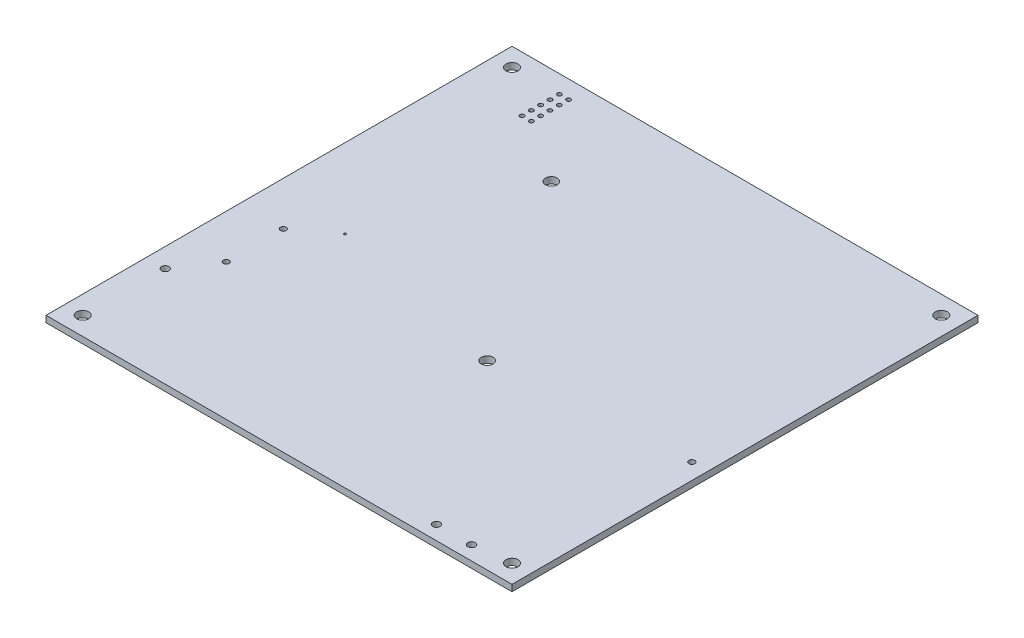
ISO-10303-21;
HEADER;
FILE_DESCRIPTION(('STEP AP214'),'2;1');
FILE_NAME('part.step','',(''),(''),'','','');
FILE_SCHEMA(('AUTOMOTIVE_DESIGN { 1 0 10303 214 1 1 1 1 }'));
ENDSEC;
DATA;
#1=APPLICATION_CONTEXT('core data for automotive mechanical design processes');
#2=APPLICATION_PROTOCOL_DEFINITION('international standard','automotive_design',2000,#1);
#3=PRODUCT_CONTEXT('',#1,'mechanical');
#4=PRODUCT('Part','Part','',(#3));
#5=PRODUCT_RELATED_PRODUCT_CATEGORY('part','',(#4));
#6=PRODUCT_DEFINITION_FORMATION('','',#4);
#7=PRODUCT_DEFINITION_CONTEXT('part definition',#1,'design');
#8=PRODUCT_DEFINITION('design','',#6,#7);
#9=PRODUCT_DEFINITION_SHAPE('','',#8);
#10=(LENGTH_UNIT() NAMED_UNIT(*) SI_UNIT(.MILLI.,.METRE.));
#11=(NAMED_UNIT(*) PLANE_ANGLE_UNIT() SI_UNIT($,.RADIAN.));
#12=(NAMED_UNIT(*) SI_UNIT($,.STERADIAN.) SOLID_ANGLE_UNIT());
#13=UNCERTAINTY_MEASURE_WITH_UNIT(LENGTH_MEASURE(1.E-05),#10,'distance_accuracy_value','');
#14=(GEOMETRIC_REPRESENTATION_CONTEXT(3) GLOBAL_UNCERTAINTY_ASSIGNED_CONTEXT((#13)) GLOBAL_UNIT_ASSIGNED_CONTEXT((#10,
#11,#12)) REPRESENTATION_CONTEXT('',''));
#15=CARTESIAN_POINT('',(0.,0.,0.));
#16=DIRECTION('',(0.,0.,1.));
#17=DIRECTION('',(1.,0.,0.));
#18=AXIS2_PLACEMENT_3D('',#15,#16,#17);
#19=CARTESIAN_POINT('',(0.,1.75,0.));
#20=DIRECTION('',(0.,1.,0.));
#21=DIRECTION('',(0.,0.,1.));
#22=AXIS2_PLACEMENT_3D('',#19,#20,#21);
#23=PLANE('',#22);
#24=CARTESIAN_POINT('',(20.323,1.75,-122.104));
#25=DIRECTION('',(0.,-1.,0.));
#26=DIRECTION('',(0.,0.,-1.));
#27=AXIS2_PLACEMENT_3D('',#24,#25,#26);
#28=CIRCLE('',#27,0.575);
#29=CARTESIAN_POINT('',(20.323,1.75,-122.679));
#30=VERTEX_POINT('',#29);
#31=EDGE_CURVE('E149',#30,#30,#28,.T.);
#32=ORIENTED_EDGE('',*,*,#31,.T.);
#33=EDGE_LOOP('',(#32));
#34=FACE_BOUND('',#33,.T.);
#35=CARTESIAN_POINT('',(17.783,1.75,-122.104));
#36=DIRECTION('',(0.,-1.,0.));
#37=DIRECTION('',(0.,0.,-1.));
#38=AXIS2_PLACEMENT_3D('',#35,#36,#37);
#39=CIRCLE('',#38,0.575);
#40=CARTESIAN_POINT('',(17.783,1.75,-122.679));
#41=VERTEX_POINT('',#40);
#42=EDGE_CURVE('E152',#41,#41,#39,.T.);
#43=ORIENTED_EDGE('',*,*,#42,.T.);
#44=EDGE_LOOP('',(#43));
#45=FACE_BOUND('',#44,.T.);
#46=CARTESIAN_POINT('',(20.323,1.75,-119.564));
#47=DIRECTION('',(0.,-1.,0.));
#48=DIRECTION('',(0.,0.,-1.));
#49=AXIS2_PLACEMENT_3D('',#46,#47,#48);
#50=CIRCLE('',#49,0.575);
#51=CARTESIAN_POINT('',(20.323,1.75,-120.139));
#52=VERTEX_POINT('',#51);
#53=EDGE_CURVE('E155',#52,#52,#50,.T.);
#54=ORIENTED_EDGE('',*,*,#53,.T.);
#55=EDGE_LOOP('',(#54));
#56=FACE_BOUND('',#55,.T.);
#57=CARTESIAN_POINT('',(17.783,1.75,-119.564));
#58=DIRECTION('',(0.,-1.,0.));
#59=DIRECTION('',(0.,0.,-1.));
#60=AXIS2_PLACEMENT_3D('',#57,#58,#59);
#61=CIRCLE('',#60,0.575);
#62=CARTESIAN_POINT('',(17.783,1.75,-120.139));
#63=VERTEX_POINT('',#62);
#64=EDGE_CURVE('E158',#63,#63,#61,.T.);
#65=ORIENTED_EDGE('',*,*,#64,.T.);
#66=EDGE_LOOP('',(#65));
#67=FACE_BOUND('',#66,.T.);
#68=CARTESIAN_POINT('',(20.323,1.75,-117.024));
#69=DIRECTION('',(0.,-1.,0.));
#70=DIRECTION('',(0.,0.,-1.));
#71=AXIS2_PLACEMENT_3D('',#68,#69,#70);
#72=CIRCLE('',#71,0.575);
#73=CARTESIAN_POINT('',(20.323,1.75,-117.599));
#74=VERTEX_POINT('',#73);
#75=EDGE_CURVE('E161',#74,#74,#72,.T.);
#76=ORIENTED_EDGE('',*,*,#75,.T.);
#77=EDGE_LOOP('',(#76));
#78=FACE_BOUND('',#77,.T.);
#79=CARTESIAN_POINT('',(17.783,1.75,-117.024));
#80=DIRECTION('',(0.,-1.,0.));
#81=DIRECTION('',(0.,0.,-1.));
#82=AXIS2_PLACEMENT_3D('',#79,#80,#81);
#83=CIRCLE('',#82,0.575);
#84=CARTESIAN_POINT('',(17.783,1.75,-117.599));
#85=VERTEX_POINT('',#84);
#86=EDGE_CURVE('E164',#85,#85,#83,.T.);
#87=ORIENTED_EDGE('',*,*,#86,.T.);
#88=EDGE_LOOP('',(#87));
#89=FACE_BOUND('',#88,.T.);
#90=CARTESIAN_POINT('',(20.323,1.75,-114.484));
#91=DIRECTION('',(0.,-1.,0.));
#92=DIRECTION('',(0.,0.,-1.));
#93=AXIS2_PLACEMENT_3D('',#90,#91,#92);
#94=CIRCLE('',#93,0.575);
#95=CARTESIAN_POINT('',(20.323,1.75,-115.059));
#96=VERTEX_POINT('',#95);
#97=EDGE_CURVE('E167',#96,#96,#94,.T.);
#98=ORIENTED_EDGE('',*,*,#97,.T.);
#99=EDGE_LOOP('',(#98));
#100=FACE_BOUND('',#99,.T.);
#101=CARTESIAN_POINT('',(17.783,1.75,-114.484));
#102=DIRECTION('',(0.,-1.,0.));
#103=DIRECTION('',(0.,0.,-1.));
#104=AXIS2_PLACEMENT_3D('',#101,#102,#103);
#105=CIRCLE('',#104,0.575);
#106=CARTESIAN_POINT('',(17.783,1.75,-115.059));
#107=VERTEX_POINT('',#106);
#108=EDGE_CURVE('E170',#107,#107,#105,.T.);
#109=ORIENTED_EDGE('',*,*,#108,.T.);
#110=EDGE_LOOP('',(#109));
#111=FACE_BOUND('',#110,.T.);
#112=CARTESIAN_POINT('',(20.323,1.75,-111.944));
#113=DIRECTION('',(0.,-1.,0.));
#114=DIRECTION('',(0.,0.,-1.));
#115=AXIS2_PLACEMENT_3D('',#112,#113,#114);
#116=CIRCLE('',#115,0.575);
#117=CARTESIAN_POINT('',(20.323,1.75,-112.519));
#118=VERTEX_POINT('',#117);
#119=EDGE_CURVE('E173',#118,#118,#116,.T.);
#120=ORIENTED_EDGE('',*,*,#119,.T.);
#121=EDGE_LOOP('',(#120));
#122=FACE_BOUND('',#121,.T.);
#123=CARTESIAN_POINT('',(17.783,1.75,-111.944));
#124=DIRECTION('',(0.,-1.,0.));
#125=DIRECTION('',(0.,0.,-1.));
#126=AXIS2_PLACEMENT_3D('',#123,#124,#125);
#127=CIRCLE('',#126,0.575);
#128=CARTESIAN_POINT('',(17.783,1.75,-112.519));
#129=VERTEX_POINT('',#128);
#130=EDGE_CURVE('E176',#129,#129,#127,.T.);
#131=ORIENTED_EDGE('',*,*,#130,.T.);
#132=EDGE_LOOP('',(#131));
#133=FACE_BOUND('',#132,.T.);
#134=CARTESIAN_POINT('',(112.136,1.75,-3.85));
#135=DIRECTION('',(0.,-1.,0.));
#136=DIRECTION('',(0.,0.,-1.));
#137=AXIS2_PLACEMENT_3D('',#134,#135,#136);
#138=CIRCLE('',#137,1.);
#139=CARTESIAN_POINT('',(112.136,1.75,-4.85));
#140=VERTEX_POINT('',#139);
#141=EDGE_CURVE('E179',#140,#140,#138,.T.);
#142=ORIENTED_EDGE('',*,*,#141,.T.);
#143=EDGE_LOOP('',(#142));
#144=FACE_BOUND('',#143,.T.);
#145=CARTESIAN_POINT('',(102.553,1.75,-3.85));
#146=DIRECTION('',(0.,-1.,0.));
#147=DIRECTION('',(0.,0.,-1.));
#148=AXIS2_PLACEMENT_3D('',#145,#146,#147);
#149=CIRCLE('',#148,1.);
#150=CARTESIAN_POINT('',(102.553,1.75,-4.85));
#151=VERTEX_POINT('',#150);
#152=EDGE_CURVE('E182',#151,#151,#149,.T.);
#153=ORIENTED_EDGE('',*,*,#152,.T.);
#154=EDGE_LOOP('',(#153));
#155=FACE_BOUND('',#154,.T.);
#156=CARTESIAN_POINT('',(70.82,1.75,-49.41));
#157=DIRECTION('',(0.,1.,0.));
#158=DIRECTION('',(0.,0.,1.));
#159=AXIS2_PLACEMENT_3D('',#156,#157,#158);
#160=CIRCLE('',#159,1.6006);
#161=CARTESIAN_POINT('',(70.82,1.75,-47.8094));
#162=VERTEX_POINT('',#161);
#163=EDGE_CURVE('E185',#162,#162,#160,.F.);
#164=ORIENTED_EDGE('',*,*,#163,.T.);
#165=EDGE_LOOP('',(#164));
#166=FACE_BOUND('',#165,.T.);
#167=CARTESIAN_POINT('',(37.258,1.75,-100.46));
#168=DIRECTION('',(0.,1.,0.));
#169=DIRECTION('',(0.,0.,1.));
#170=AXIS2_PLACEMENT_3D('',#167,#168,#169);
#171=CIRCLE('',#170,1.6006);
#172=CARTESIAN_POINT('',(37.258,1.75,-98.8594));
#173=VERTEX_POINT('',#172);
#174=EDGE_CURVE('E188',#173,#173,#171,.F.);
#175=ORIENTED_EDGE('',*,*,#174,.T.);
#176=EDGE_LOOP('',(#175));
#177=FACE_BOUND('',#176,.T.);
#178=CARTESIAN_POINT('',(5.24,1.75,-27.25));
#179=DIRECTION('',(0.,-1.,0.));
#180=DIRECTION('',(0.,0.,-1.));
#181=AXIS2_PLACEMENT_3D('',#178,#179,#180);
#182=CIRCLE('',#181,1.);
#183=CARTESIAN_POINT('',(5.24,1.75,-28.25));
#184=VERTEX_POINT('',#183);
#185=EDGE_CURVE('E191',#184,#184,#182,.T.);
#186=ORIENTED_EDGE('',*,*,#185,.T.);
#187=EDGE_LOOP('',(#186));
#188=FACE_BOUND('',#187,.T.);
#189=CARTESIAN_POINT('',(11.95,1.75,-52.73));
#190=DIRECTION('',(0.,-1.,0.));
#191=DIRECTION('',(0.,0.,-1.));
#192=AXIS2_PLACEMENT_3D('',#189,#190,#191);
#193=CIRCLE('',#192,0.79);
#194=CARTESIAN_POINT('',(11.95,1.75,-53.52));
#195=VERTEX_POINT('',#194);
#196=EDGE_CURVE('E194',#195,#195,#193,.T.);
#197=ORIENTED_EDGE('',*,*,#196,.T.);
#198=EDGE_LOOP('',(#197));
#199=FACE_BOUND('',#198,.T.);
#200=CARTESIAN_POINT('',(11.95,1.75,-37.18));
#201=DIRECTION('',(0.,-1.,0.));
#202=DIRECTION('',(0.,0.,-1.));
#203=AXIS2_PLACEMENT_3D('',#200,#201,#202);
#204=CIRCLE('',#203,0.79);
#205=CARTESIAN_POINT('',(11.95,1.75,-37.97));
#206=VERTEX_POINT('',#205);
#207=EDGE_CURVE('E197',#206,#206,#204,.T.);
#208=ORIENTED_EDGE('',*,*,#207,.T.);
#209=EDGE_LOOP('',(#208));
#210=FACE_BOUND('',#209,.T.);
#211=CARTESIAN_POINT('',(21.52,1.75,-59.93));
#212=DIRECTION('',(0.,-1.,0.));
#213=DIRECTION('',(0.,0.,-1.));
#214=AXIS2_PLACEMENT_3D('',#211,#212,#213);
#215=CIRCLE('',#214,0.3);
#216=CARTESIAN_POINT('',(21.52,1.75,-60.23));
#217=VERTEX_POINT('',#216);
#218=EDGE_CURVE('E200',#217,#217,#215,.T.);
#219=ORIENTED_EDGE('',*,*,#218,.T.);
#220=EDGE_LOOP('',(#219));
#221=FACE_BOUND('',#220,.T.);
#222=CARTESIAN_POINT('',(122.64,1.75,-53.37));
#223=DIRECTION('',(0.,-1.,0.));
#224=DIRECTION('',(0.,0.,-1.));
#225=AXIS2_PLACEMENT_3D('',#222,#223,#224);
#226=CIRCLE('',#225,0.8);
#227=CARTESIAN_POINT('',(122.64,1.75,-54.17));
#228=VERTEX_POINT('',#227);
#229=EDGE_CURVE('E203',#228,#228,#226,.T.);
#230=ORIENTED_EDGE('',*,*,#229,.T.);
#231=EDGE_LOOP('',(#230));
#232=FACE_BOUND('',#231,.T.);
#233=CARTESIAN_POINT('',(122.,1.75,-122.));
#234=DIRECTION('',(0.,-1.,0.));
#235=DIRECTION('',(0.,0.,-1.));
#236=AXIS2_PLACEMENT_3D('',#233,#234,#235);
#237=CIRCLE('',#236,1.65);
#238=CARTESIAN_POINT('',(122.,1.75,-123.65));
#239=VERTEX_POINT('',#238);
#240=EDGE_CURVE('E206',#239,#239,#237,.T.);
#241=ORIENTED_EDGE('',*,*,#240,.T.);
#242=EDGE_LOOP('',(#241));
#243=FACE_BOUND('',#242,.T.);
#244=CARTESIAN_POINT('',(5.,1.75,-122.));
#245=DIRECTION('',(0.,-1.,0.));
#246=DIRECTION('',(0.,0.,-1.));
#247=AXIS2_PLACEMENT_3D('',#244,#245,#246);
#248=CIRCLE('',#247,1.65);
#249=CARTESIAN_POINT('',(5.,1.75,-123.65));
#250=VERTEX_POINT('',#249);
#251=EDGE_CURVE('E209',#250,#250,#248,.T.);
#252=ORIENTED_EDGE('',*,*,#251,.T.);
#253=EDGE_LOOP('',(#252));
#254=FACE_BOUND('',#253,.T.);
#255=CARTESIAN_POINT('',(122.,1.75,-5.));
#256=DIRECTION('',(0.,-1.,0.));
#257=DIRECTION('',(0.,0.,-1.));
#258=AXIS2_PLACEMENT_3D('',#255,#256,#257);
#259=CIRCLE('',#258,1.65);
#260=CARTESIAN_POINT('',(122.,1.75,-6.65));
#261=VERTEX_POINT('',#260);
#262=EDGE_CURVE('E211',#261,#261,#259,.T.);
#263=ORIENTED_EDGE('',*,*,#262,.T.);
#264=EDGE_LOOP('',(#263));
#265=FACE_BOUND('',#264,.T.);
#266=CARTESIAN_POINT('',(5.,1.75,-5.));
#267=DIRECTION('',(0.,-1.,0.));
#268=DIRECTION('',(0.,0.,-1.));
#269=AXIS2_PLACEMENT_3D('',#266,#267,#268);
#270=CIRCLE('',#269,1.65);
#271=CARTESIAN_POINT('',(5.,1.75,-6.65));
#272=VERTEX_POINT('',#271);
#273=EDGE_CURVE('E20',#272,#272,#270,.T.);
#274=ORIENTED_EDGE('',*,*,#273,.T.);
#275=EDGE_LOOP('',(#274));
#276=FACE_BOUND('',#275,.T.);
#277=DIRECTION('',(0.,0.,1.));
#278=VECTOR('',#277,1.);
#279=CARTESIAN_POINT('',(0.,1.75,-127.));
#280=LINE('',#279,#278);
#281=CARTESIAN_POINT('',(0.,1.75,0.));
#282=VERTEX_POINT('',#281);
#283=CARTESIAN_POINT('',(0.,1.75,-127.));
#284=VERTEX_POINT('',#283);
#285=EDGE_CURVE('E71',#282,#284,#280,.F.);
#286=ORIENTED_EDGE('',*,*,#285,.F.);
#287=DIRECTION('',(1.,0.,0.));
#288=VECTOR('',#287,1.);
#289=CARTESIAN_POINT('',(0.,1.75,0.));
#290=LINE('',#289,#288);
#291=CARTESIAN_POINT('',(127.,1.75,0.));
#292=VERTEX_POINT('',#291);
#293=EDGE_CURVE('E68',#292,#282,#290,.F.);
#294=ORIENTED_EDGE('',*,*,#293,.F.);
#295=DIRECTION('',(0.,0.,-1.));
#296=VECTOR('',#295,1.);
#297=CARTESIAN_POINT('',(127.,1.75,0.));
#298=LINE('',#297,#296);
#299=CARTESIAN_POINT('',(127.,1.75,-127.));
#300=VERTEX_POINT('',#299);
#301=EDGE_CURVE('E59',#300,#292,#298,.F.);
#302=ORIENTED_EDGE('',*,*,#301,.F.);
#303=DIRECTION('',(-1.,0.,0.));
#304=VECTOR('',#303,1.);
#305=CARTESIAN_POINT('',(127.,1.75,-127.));
#306=LINE('',#305,#304);
#307=EDGE_CURVE('E54',#284,#300,#306,.F.);
#308=ORIENTED_EDGE('',*,*,#307,.F.);
#309=EDGE_LOOP('',(#286,#294,#302,#308));
#310=FACE_BOUND('',#309,.T.);
#311=ADVANCED_FACE('F17',(#34,#45,#56,#67,#78,#89,#100,#111,#122,#133,#144,#155,#166,#177,#188,
#199,#210,#221,#232,#243,#254,#265,#276,#310),#23,.T.);
#312=CARTESIAN_POINT('',(0.,0.,0.));
#313=DIRECTION('',(0.,0.,1.));
#314=DIRECTION('',(1.,0.,0.));
#315=AXIS2_PLACEMENT_3D('',#312,#313,#314);
#316=PLANE('',#315);
#317=DIRECTION('',(0.,1.,0.));
#318=VECTOR('',#317,1.);
#319=CARTESIAN_POINT('',(0.,0.,0.));
#320=LINE('',#319,#318);
#321=CARTESIAN_POINT('',(0.,0.,0.));
#322=VERTEX_POINT('',#321);
#323=EDGE_CURVE('E219',#322,#282,#320,.T.);
#324=ORIENTED_EDGE('',*,*,#323,.F.);
#325=DIRECTION('',(1.,0.,0.));
#326=VECTOR('',#325,1.);
#327=CARTESIAN_POINT('',(0.,0.,0.));
#328=LINE('',#327,#326);
#329=CARTESIAN_POINT('',(127.,0.,0.));
#330=VERTEX_POINT('',#329);
#331=EDGE_CURVE('E78',#322,#330,#328,.T.);
#332=ORIENTED_EDGE('',*,*,#331,.T.);
#333=DIRECTION('',(0.,1.,0.));
#334=VECTOR('',#333,1.);
#335=CARTESIAN_POINT('',(127.,0.,0.));
#336=LINE('',#335,#334);
#337=EDGE_CURVE('E64',#292,#330,#336,.F.);
#338=ORIENTED_EDGE('',*,*,#337,.F.);
#339=ORIENTED_EDGE('',*,*,#293,.T.);
#340=EDGE_LOOP('',(#324,#332,#338,#339));
#341=FACE_BOUND('',#340,.T.);
#342=ADVANCED_FACE('F77',(#341),#316,.T.);
#343=CARTESIAN_POINT('',(127.,0.,0.));
#344=DIRECTION('',(1.,0.,0.));
#345=DIRECTION('',(0.,0.,-1.));
#346=AXIS2_PLACEMENT_3D('',#343,#344,#345);
#347=PLANE('',#346);
#348=ORIENTED_EDGE('',*,*,#337,.T.);
#349=DIRECTION('',(0.,0.,1.));
#350=VECTOR('',#349,1.);
#351=CARTESIAN_POINT('',(127.,0.,0.));
#352=LINE('',#351,#350);
#353=CARTESIAN_POINT('',(127.,0.,-127.));
#354=VERTEX_POINT('',#353);
#355=EDGE_CURVE('E230',#330,#354,#352,.F.);
#356=ORIENTED_EDGE('',*,*,#355,.T.);
#357=DIRECTION('',(0.,1.,0.));
#358=VECTOR('',#357,1.);
#359=CARTESIAN_POINT('',(127.,0.,-127.));
#360=LINE('',#359,#358);
#361=EDGE_CURVE('E66',#300,#354,#360,.F.);
#362=ORIENTED_EDGE('',*,*,#361,.F.);
#363=ORIENTED_EDGE('',*,*,#301,.T.);
#364=EDGE_LOOP('',(#348,#356,#362,#363));
#365=FACE_BOUND('',#364,.T.);
#366=ADVANCED_FACE('F61',(#365),#347,.T.);
#367=CARTESIAN_POINT('',(127.,0.,-127.));
#368=DIRECTION('',(0.,0.,-1.));
#369=DIRECTION('',(-1.,0.,0.));
#370=AXIS2_PLACEMENT_3D('',#367,#368,#369);
#371=PLANE('',#370);
#372=ORIENTED_EDGE('',*,*,#361,.T.);
#373=DIRECTION('',(1.,0.,0.));
#374=VECTOR('',#373,1.);
#375=CARTESIAN_POINT('',(0.,0.,-127.));
#376=LINE('',#375,#374);
#377=CARTESIAN_POINT('',(0.,0.,-127.));
#378=VERTEX_POINT('',#377);
#379=EDGE_CURVE('E227',#354,#378,#376,.F.);
#380=ORIENTED_EDGE('',*,*,#379,.T.);
#381=DIRECTION('',(0.,1.,0.));
#382=VECTOR('',#381,1.);
#383=CARTESIAN_POINT('',(0.,0.,-127.));
#384=LINE('',#383,#382);
#385=EDGE_CURVE('E35',#284,#378,#384,.F.);
#386=ORIENTED_EDGE('',*,*,#385,.F.);
#387=ORIENTED_EDGE('',*,*,#307,.T.);
#388=EDGE_LOOP('',(#372,#380,#386,#387));
#389=FACE_BOUND('',#388,.T.);
#390=ADVANCED_FACE('F226',(#389),#371,.T.);
#391=CARTESIAN_POINT('',(0.,0.,-127.));
#392=DIRECTION('',(-1.,0.,0.));
#393=DIRECTION('',(0.,0.,1.));
#394=AXIS2_PLACEMENT_3D('',#391,#392,#393);
#395=PLANE('',#394);
#396=ORIENTED_EDGE('',*,*,#385,.T.);
#397=DIRECTION('',(0.,0.,1.));
#398=VECTOR('',#397,1.);
#399=CARTESIAN_POINT('',(0.,0.,0.));
#400=LINE('',#399,#398);
#401=EDGE_CURVE('E148',#378,#322,#400,.T.);
#402=ORIENTED_EDGE('',*,*,#401,.T.);
#403=ORIENTED_EDGE('',*,*,#323,.T.);
#404=ORIENTED_EDGE('',*,*,#285,.T.);
#405=EDGE_LOOP('',(#396,#402,#403,#404));
#406=FACE_BOUND('',#405,.T.);
#407=ADVANCED_FACE('F233',(#406),#395,.T.);
#408=CARTESIAN_POINT('',(5.,1.75,-5.));
#409=DIRECTION('',(0.,-1.,0.));
#410=DIRECTION('',(0.,0.,-1.));
#411=AXIS2_PLACEMENT_3D('',#408,#409,#410);
#412=CYLINDRICAL_SURFACE('',#411,1.65);
#413=ORIENTED_EDGE('',*,*,#273,.F.);
#414=EDGE_LOOP('',(#413));
#415=FACE_BOUND('',#414,.T.);
#416=CARTESIAN_POINT('',(5.,0.,-5.));
#417=DIRECTION('',(0.,-1.,0.));
#418=DIRECTION('',(0.,0.,-1.));
#419=AXIS2_PLACEMENT_3D('',#416,#417,#418);
#420=CIRCLE('',#419,1.65);
#421=CARTESIAN_POINT('',(5.,0.,-6.65));
#422=VERTEX_POINT('',#421);
#423=EDGE_CURVE('E145',#422,#422,#420,.T.);
#424=ORIENTED_EDGE('',*,*,#423,.T.);
#425=EDGE_LOOP('',(#424));
#426=FACE_BOUND('',#425,.T.);
#427=ADVANCED_FACE('F235',(#415,#426),#412,.F.);
#428=CARTESIAN_POINT('',(122.,1.75,-5.));
#429=DIRECTION('',(0.,-1.,0.));
#430=DIRECTION('',(0.,0.,-1.));
#431=AXIS2_PLACEMENT_3D('',#428,#429,#430);
#432=CYLINDRICAL_SURFACE('',#431,1.65);
#433=ORIENTED_EDGE('',*,*,#262,.F.);
#434=EDGE_LOOP('',(#433));
#435=FACE_BOUND('',#434,.T.);
#436=CARTESIAN_POINT('',(122.,0.,-5.));
#437=DIRECTION('',(0.,-1.,0.));
#438=DIRECTION('',(0.,0.,-1.));
#439=AXIS2_PLACEMENT_3D('',#436,#437,#438);
#440=CIRCLE('',#439,1.65);
#441=CARTESIAN_POINT('',(122.,0.,-6.65));
#442=VERTEX_POINT('',#441);
#443=EDGE_CURVE('E142',#442,#442,#440,.T.);
#444=ORIENTED_EDGE('',*,*,#443,.T.);
#445=EDGE_LOOP('',(#444));
#446=FACE_BOUND('',#445,.T.);
#447=ADVANCED_FACE('F242',(#435,#446),#432,.F.);
#448=CARTESIAN_POINT('',(5.,1.75,-122.));
#449=DIRECTION('',(0.,-1.,0.));
#450=DIRECTION('',(0.,0.,-1.));
#451=AXIS2_PLACEMENT_3D('',#448,#449,#450);
#452=CYLINDRICAL_SURFACE('',#451,1.65);
#453=ORIENTED_EDGE('',*,*,#251,.F.);
#454=EDGE_LOOP('',(#453));
#455=FACE_BOUND('',#454,.T.);
#456=CARTESIAN_POINT('',(5.,0.,-122.));
#457=DIRECTION('',(0.,-1.,0.));
#458=DIRECTION('',(0.,0.,-1.));
#459=AXIS2_PLACEMENT_3D('',#456,#457,#458);
#460=CIRCLE('',#459,1.65);
#461=CARTESIAN_POINT('',(5.,0.,-123.65));
#462=VERTEX_POINT('',#461);
#463=EDGE_CURVE('E139',#462,#462,#460,.T.);
#464=ORIENTED_EDGE('',*,*,#463,.T.);
#465=EDGE_LOOP('',(#464));
#466=FACE_BOUND('',#465,.T.);
#467=ADVANCED_FACE('F333',(#455,#466),#452,.F.);
#468=CARTESIAN_POINT('',(122.,1.75,-122.));
#469=DIRECTION('',(0.,-1.,0.));
#470=DIRECTION('',(0.,0.,-1.));
#471=AXIS2_PLACEMENT_3D('',#468,#469,#470);
#472=CYLINDRICAL_SURFACE('',#471,1.65);
#473=ORIENTED_EDGE('',*,*,#240,.F.);
#474=EDGE_LOOP('',(#473));
#475=FACE_BOUND('',#474,.T.);
#476=CARTESIAN_POINT('',(122.,0.,-122.));
#477=DIRECTION('',(0.,-1.,0.));
#478=DIRECTION('',(0.,0.,-1.));
#479=AXIS2_PLACEMENT_3D('',#476,#477,#478);
#480=CIRCLE('',#479,1.65);
#481=CARTESIAN_POINT('',(122.,0.,-123.65));
#482=VERTEX_POINT('',#481);
#483=EDGE_CURVE('E136',#482,#482,#480,.T.);
#484=ORIENTED_EDGE('',*,*,#483,.T.);
#485=EDGE_LOOP('',(#484));
#486=FACE_BOUND('',#485,.T.);
#487=ADVANCED_FACE('F329',(#475,#486),#472,.F.);
#488=CARTESIAN_POINT('',(122.64,1.75,-53.37));
#489=DIRECTION('',(0.,-1.,0.));
#490=DIRECTION('',(0.,0.,-1.));
#491=AXIS2_PLACEMENT_3D('',#488,#489,#490);
#492=CYLINDRICAL_SURFACE('',#491,0.8);
#493=ORIENTED_EDGE('',*,*,#229,.F.);
#494=EDGE_LOOP('',(#493));
#495=FACE_BOUND('',#494,.T.);
#496=CARTESIAN_POINT('',(122.64,0.,-53.37));
#497=DIRECTION('',(0.,-1.,0.));
#498=DIRECTION('',(0.,0.,-1.));
#499=AXIS2_PLACEMENT_3D('',#496,#497,#498);
#500=CIRCLE('',#499,0.8);
#501=CARTESIAN_POINT('',(122.64,0.,-54.17));
#502=VERTEX_POINT('',#501);
#503=EDGE_CURVE('E133',#502,#502,#500,.T.);
#504=ORIENTED_EDGE('',*,*,#503,.T.);
#505=EDGE_LOOP('',(#504));
#506=FACE_BOUND('',#505,.T.);
#507=ADVANCED_FACE('F325',(#495,#506),#492,.F.);
#508=CARTESIAN_POINT('',(21.52,1.75,-59.93));
#509=DIRECTION('',(0.,-1.,0.));
#510=DIRECTION('',(0.,0.,-1.));
#511=AXIS2_PLACEMENT_3D('',#508,#509,#510);
#512=CYLINDRICAL_SURFACE('',#511,0.3);
#513=ORIENTED_EDGE('',*,*,#218,.F.);
#514=EDGE_LOOP('',(#513));
#515=FACE_BOUND('',#514,.T.);
#516=CARTESIAN_POINT('',(21.52,0.,-59.93));
#517=DIRECTION('',(0.,-1.,0.));
#518=DIRECTION('',(0.,0.,-1.));
#519=AXIS2_PLACEMENT_3D('',#516,#517,#518);
#520=CIRCLE('',#519,0.3);
#521=CARTESIAN_POINT('',(21.52,0.,-60.23));
#522=VERTEX_POINT('',#521);
#523=EDGE_CURVE('E130',#522,#522,#520,.T.);
#524=ORIENTED_EDGE('',*,*,#523,.T.);
#525=EDGE_LOOP('',(#524));
#526=FACE_BOUND('',#525,.T.);
#527=ADVANCED_FACE('F321',(#515,#526),#512,.F.);
#528=CARTESIAN_POINT('',(11.95,1.75,-37.18));
#529=DIRECTION('',(0.,-1.,0.));
#530=DIRECTION('',(0.,0.,-1.));
#531=AXIS2_PLACEMENT_3D('',#528,#529,#530);
#532=CYLINDRICAL_SURFACE('',#531,0.79);
#533=ORIENTED_EDGE('',*,*,#207,.F.);
#534=EDGE_LOOP('',(#533));
#535=FACE_BOUND('',#534,.T.);
#536=CARTESIAN_POINT('',(11.95,0.,-37.18));
#537=DIRECTION('',(0.,-1.,0.));
#538=DIRECTION('',(0.,0.,-1.));
#539=AXIS2_PLACEMENT_3D('',#536,#537,#538);
#540=CIRCLE('',#539,0.79);
#541=CARTESIAN_POINT('',(11.95,0.,-37.97));
#542=VERTEX_POINT('',#541);
#543=EDGE_CURVE('E127',#542,#542,#540,.T.);
#544=ORIENTED_EDGE('',*,*,#543,.T.);
#545=EDGE_LOOP('',(#544));
#546=FACE_BOUND('',#545,.T.);
#547=ADVANCED_FACE('F317',(#535,#546),#532,.F.);
#548=CARTESIAN_POINT('',(11.95,1.75,-52.73));
#549=DIRECTION('',(0.,-1.,0.));
#550=DIRECTION('',(0.,0.,-1.));
#551=AXIS2_PLACEMENT_3D('',#548,#549,#550);
#552=CYLINDRICAL_SURFACE('',#551,0.79);
#553=ORIENTED_EDGE('',*,*,#196,.F.);
#554=EDGE_LOOP('',(#553));
#555=FACE_BOUND('',#554,.T.);
#556=CARTESIAN_POINT('',(11.95,0.,-52.73));
#557=DIRECTION('',(0.,-1.,0.));
#558=DIRECTION('',(0.,0.,-1.));
#559=AXIS2_PLACEMENT_3D('',#556,#557,#558);
#560=CIRCLE('',#559,0.79);
#561=CARTESIAN_POINT('',(11.95,0.,-53.52));
#562=VERTEX_POINT('',#561);
#563=EDGE_CURVE('E124',#562,#562,#560,.T.);
#564=ORIENTED_EDGE('',*,*,#563,.T.);
#565=EDGE_LOOP('',(#564));
#566=FACE_BOUND('',#565,.T.);
#567=ADVANCED_FACE('F313',(#555,#566),#552,.F.);
#568=CARTESIAN_POINT('',(5.24,1.75,-27.25));
#569=DIRECTION('',(0.,-1.,0.));
#570=DIRECTION('',(0.,0.,-1.));
#571=AXIS2_PLACEMENT_3D('',#568,#569,#570);
#572=CYLINDRICAL_SURFACE('',#571,1.);
#573=ORIENTED_EDGE('',*,*,#185,.F.);
#574=EDGE_LOOP('',(#573));
#575=FACE_BOUND('',#574,.T.);
#576=CARTESIAN_POINT('',(5.24,0.,-27.25));
#577=DIRECTION('',(0.,-1.,0.));
#578=DIRECTION('',(0.,0.,-1.));
#579=AXIS2_PLACEMENT_3D('',#576,#577,#578);
#580=CIRCLE('',#579,1.);
#581=CARTESIAN_POINT('',(5.24,0.,-28.25));
#582=VERTEX_POINT('',#581);
#583=EDGE_CURVE('E121',#582,#582,#580,.T.);
#584=ORIENTED_EDGE('',*,*,#583,.T.);
#585=EDGE_LOOP('',(#584));
#586=FACE_BOUND('',#585,.T.);
#587=ADVANCED_FACE('F309',(#575,#586),#572,.F.);
#588=CARTESIAN_POINT('',(37.258,1.75,-100.46));
#589=DIRECTION('',(0.,1.,0.));
#590=DIRECTION('',(0.,0.,1.));
#591=AXIS2_PLACEMENT_3D('',#588,#589,#590);
#592=CYLINDRICAL_SURFACE('',#591,1.6006);
#593=ORIENTED_EDGE('',*,*,#174,.F.);
#594=EDGE_LOOP('',(#593));
#595=FACE_BOUND('',#594,.T.);
#596=CARTESIAN_POINT('',(37.258,0.,-100.46));
#597=DIRECTION('',(0.,1.,0.));
#598=DIRECTION('',(0.,0.,1.));
#599=AXIS2_PLACEMENT_3D('',#596,#597,#598);
#600=CIRCLE('',#599,1.6006);
#601=CARTESIAN_POINT('',(37.258,0.,-98.8594));
#602=VERTEX_POINT('',#601);
#603=EDGE_CURVE('E118',#602,#602,#600,.F.);
#604=ORIENTED_EDGE('',*,*,#603,.T.);
#605=EDGE_LOOP('',(#604));
#606=FACE_BOUND('',#605,.T.);
#607=ADVANCED_FACE('F305',(#595,#606),#592,.F.);
#608=CARTESIAN_POINT('',(70.82,1.75,-49.41));
#609=DIRECTION('',(0.,1.,0.));
#610=DIRECTION('',(0.,0.,1.));
#611=AXIS2_PLACEMENT_3D('',#608,#609,#610);
#612=CYLINDRICAL_SURFACE('',#611,1.6006);
#613=ORIENTED_EDGE('',*,*,#163,.F.);
#614=EDGE_LOOP('',(#613));
#615=FACE_BOUND('',#614,.T.);
#616=CARTESIAN_POINT('',(70.82,0.,-49.41));
#617=DIRECTION('',(0.,1.,0.));
#618=DIRECTION('',(0.,0.,1.));
#619=AXIS2_PLACEMENT_3D('',#616,#617,#618);
#620=CIRCLE('',#619,1.6006);
#621=CARTESIAN_POINT('',(70.82,0.,-47.8094));
#622=VERTEX_POINT('',#621);
#623=EDGE_CURVE('E115',#622,#622,#620,.F.);
#624=ORIENTED_EDGE('',*,*,#623,.T.);
#625=EDGE_LOOP('',(#624));
#626=FACE_BOUND('',#625,.T.);
#627=ADVANCED_FACE('F301',(#615,#626),#612,.F.);
#628=CARTESIAN_POINT('',(102.553,1.75,-3.85));
#629=DIRECTION('',(0.,-1.,0.));
#630=DIRECTION('',(0.,0.,-1.));
#631=AXIS2_PLACEMENT_3D('',#628,#629,#630);
#632=CYLINDRICAL_SURFACE('',#631,1.);
#633=ORIENTED_EDGE('',*,*,#152,.F.);
#634=EDGE_LOOP('',(#633));
#635=FACE_BOUND('',#634,.T.);
#636=CARTESIAN_POINT('',(102.553,0.,-3.85));
#637=DIRECTION('',(0.,-1.,0.));
#638=DIRECTION('',(0.,0.,-1.));
#639=AXIS2_PLACEMENT_3D('',#636,#637,#638);
#640=CIRCLE('',#639,1.);
#641=CARTESIAN_POINT('',(102.553,0.,-4.85));
#642=VERTEX_POINT('',#641);
#643=EDGE_CURVE('E112',#642,#642,#640,.T.);
#644=ORIENTED_EDGE('',*,*,#643,.T.);
#645=EDGE_LOOP('',(#644));
#646=FACE_BOUND('',#645,.T.);
#647=ADVANCED_FACE('F297',(#635,#646),#632,.F.);
#648=CARTESIAN_POINT('',(112.136,1.75,-3.85));
#649=DIRECTION('',(0.,-1.,0.));
#650=DIRECTION('',(0.,0.,-1.));
#651=AXIS2_PLACEMENT_3D('',#648,#649,#650);
#652=CYLINDRICAL_SURFACE('',#651,1.);
#653=ORIENTED_EDGE('',*,*,#141,.F.);
#654=EDGE_LOOP('',(#653));
#655=FACE_BOUND('',#654,.T.);
#656=CARTESIAN_POINT('',(112.136,0.,-3.85));
#657=DIRECTION('',(0.,-1.,0.));
#658=DIRECTION('',(0.,0.,-1.));
#659=AXIS2_PLACEMENT_3D('',#656,#657,#658);
#660=CIRCLE('',#659,1.);
#661=CARTESIAN_POINT('',(112.136,0.,-4.85));
#662=VERTEX_POINT('',#661);
#663=EDGE_CURVE('E109',#662,#662,#660,.T.);
#664=ORIENTED_EDGE('',*,*,#663,.T.);
#665=EDGE_LOOP('',(#664));
#666=FACE_BOUND('',#665,.T.);
#667=ADVANCED_FACE('F293',(#655,#666),#652,.F.);
#668=CARTESIAN_POINT('',(17.783,1.75,-111.944));
#669=DIRECTION('',(0.,-1.,0.));
#670=DIRECTION('',(0.,0.,-1.));
#671=AXIS2_PLACEMENT_3D('',#668,#669,#670);
#672=CYLINDRICAL_SURFACE('',#671,0.575);
#673=ORIENTED_EDGE('',*,*,#130,.F.);
#674=EDGE_LOOP('',(#673));
#675=FACE_BOUND('',#674,.T.);
#676=CARTESIAN_POINT('',(17.783,0.,-111.944));
#677=DIRECTION('',(0.,-1.,0.));
#678=DIRECTION('',(0.,0.,-1.));
#679=AXIS2_PLACEMENT_3D('',#676,#677,#678);
#680=CIRCLE('',#679,0.575);
#681=CARTESIAN_POINT('',(17.783,0.,-112.519));
#682=VERTEX_POINT('',#681);
#683=EDGE_CURVE('E106',#682,#682,#680,.T.);
#684=ORIENTED_EDGE('',*,*,#683,.T.);
#685=EDGE_LOOP('',(#684));
#686=FACE_BOUND('',#685,.T.);
#687=ADVANCED_FACE('F289',(#675,#686),#672,.F.);
#688=CARTESIAN_POINT('',(20.323,1.75,-111.944));
#689=DIRECTION('',(0.,-1.,0.));
#690=DIRECTION('',(0.,0.,-1.));
#691=AXIS2_PLACEMENT_3D('',#688,#689,#690);
#692=CYLINDRICAL_SURFACE('',#691,0.575);
#693=ORIENTED_EDGE('',*,*,#119,.F.);
#694=EDGE_LOOP('',(#693));
#695=FACE_BOUND('',#694,.T.);
#696=CARTESIAN_POINT('',(20.323,0.,-111.944));
#697=DIRECTION('',(0.,-1.,0.));
#698=DIRECTION('',(0.,0.,-1.));
#699=AXIS2_PLACEMENT_3D('',#696,#697,#698);
#700=CIRCLE('',#699,0.575);
#701=CARTESIAN_POINT('',(20.323,0.,-112.519));
#702=VERTEX_POINT('',#701);
#703=EDGE_CURVE('E103',#702,#702,#700,.T.);
#704=ORIENTED_EDGE('',*,*,#703,.T.);
#705=EDGE_LOOP('',(#704));
#706=FACE_BOUND('',#705,.T.);
#707=ADVANCED_FACE('F285',(#695,#706),#692,.F.);
#708=CARTESIAN_POINT('',(17.783,1.75,-114.484));
#709=DIRECTION('',(0.,-1.,0.));
#710=DIRECTION('',(0.,0.,-1.));
#711=AXIS2_PLACEMENT_3D('',#708,#709,#710);
#712=CYLINDRICAL_SURFACE('',#711,0.575);
#713=ORIENTED_EDGE('',*,*,#108,.F.);
#714=EDGE_LOOP('',(#713));
#715=FACE_BOUND('',#714,.T.);
#716=CARTESIAN_POINT('',(17.783,0.,-114.484));
#717=DIRECTION('',(0.,-1.,0.));
#718=DIRECTION('',(0.,0.,-1.));
#719=AXIS2_PLACEMENT_3D('',#716,#717,#718);
#720=CIRCLE('',#719,0.575);
#721=CARTESIAN_POINT('',(17.783,0.,-115.059));
#722=VERTEX_POINT('',#721);
#723=EDGE_CURVE('E100',#722,#722,#720,.T.);
#724=ORIENTED_EDGE('',*,*,#723,.T.);
#725=EDGE_LOOP('',(#724));
#726=FACE_BOUND('',#725,.T.);
#727=ADVANCED_FACE('F281',(#715,#726),#712,.F.);
#728=CARTESIAN_POINT('',(20.323,1.75,-114.484));
#729=DIRECTION('',(0.,-1.,0.));
#730=DIRECTION('',(0.,0.,-1.));
#731=AXIS2_PLACEMENT_3D('',#728,#729,#730);
#732=CYLINDRICAL_SURFACE('',#731,0.575);
#733=ORIENTED_EDGE('',*,*,#97,.F.);
#734=EDGE_LOOP('',(#733));
#735=FACE_BOUND('',#734,.T.);
#736=CARTESIAN_POINT('',(20.323,0.,-114.484));
#737=DIRECTION('',(0.,-1.,0.));
#738=DIRECTION('',(0.,0.,-1.));
#739=AXIS2_PLACEMENT_3D('',#736,#737,#738);
#740=CIRCLE('',#739,0.575);
#741=CARTESIAN_POINT('',(20.323,0.,-115.059));
#742=VERTEX_POINT('',#741);
#743=EDGE_CURVE('E97',#742,#742,#740,.T.);
#744=ORIENTED_EDGE('',*,*,#743,.T.);
#745=EDGE_LOOP('',(#744));
#746=FACE_BOUND('',#745,.T.);
#747=ADVANCED_FACE('F277',(#735,#746),#732,.F.);
#748=CARTESIAN_POINT('',(17.783,1.75,-117.024));
#749=DIRECTION('',(0.,-1.,0.));
#750=DIRECTION('',(0.,0.,-1.));
#751=AXIS2_PLACEMENT_3D('',#748,#749,#750);
#752=CYLINDRICAL_SURFACE('',#751,0.575);
#753=ORIENTED_EDGE('',*,*,#86,.F.);
#754=EDGE_LOOP('',(#753));
#755=FACE_BOUND('',#754,.T.);
#756=CARTESIAN_POINT('',(17.783,0.,-117.024));
#757=DIRECTION('',(0.,-1.,0.));
#758=DIRECTION('',(0.,0.,-1.));
#759=AXIS2_PLACEMENT_3D('',#756,#757,#758);
#760=CIRCLE('',#759,0.575);
#761=CARTESIAN_POINT('',(17.783,0.,-117.599));
#762=VERTEX_POINT('',#761);
#763=EDGE_CURVE('E94',#762,#762,#760,.T.);
#764=ORIENTED_EDGE('',*,*,#763,.T.);
#765=EDGE_LOOP('',(#764));
#766=FACE_BOUND('',#765,.T.);
#767=ADVANCED_FACE('F273',(#755,#766),#752,.F.);
#768=CARTESIAN_POINT('',(20.323,1.75,-117.024));
#769=DIRECTION('',(0.,-1.,0.));
#770=DIRECTION('',(0.,0.,-1.));
#771=AXIS2_PLACEMENT_3D('',#768,#769,#770);
#772=CYLINDRICAL_SURFACE('',#771,0.575);
#773=ORIENTED_EDGE('',*,*,#75,.F.);
#774=EDGE_LOOP('',(#773));
#775=FACE_BOUND('',#774,.T.);
#776=CARTESIAN_POINT('',(20.323,0.,-117.024));
#777=DIRECTION('',(0.,-1.,0.));
#778=DIRECTION('',(0.,0.,-1.));
#779=AXIS2_PLACEMENT_3D('',#776,#777,#778);
#780=CIRCLE('',#779,0.575);
#781=CARTESIAN_POINT('',(20.323,0.,-117.599));
#782=VERTEX_POINT('',#781);
#783=EDGE_CURVE('E91',#782,#782,#780,.T.);
#784=ORIENTED_EDGE('',*,*,#783,.T.);
#785=EDGE_LOOP('',(#784));
#786=FACE_BOUND('',#785,.T.);
#787=ADVANCED_FACE('F269',(#775,#786),#772,.F.);
#788=CARTESIAN_POINT('',(17.783,1.75,-119.564));
#789=DIRECTION('',(0.,-1.,0.));
#790=DIRECTION('',(0.,0.,-1.));
#791=AXIS2_PLACEMENT_3D('',#788,#789,#790);
#792=CYLINDRICAL_SURFACE('',#791,0.575);
#793=ORIENTED_EDGE('',*,*,#64,.F.);
#794=EDGE_LOOP('',(#793));
#795=FACE_BOUND('',#794,.T.);
#796=CARTESIAN_POINT('',(17.783,0.,-119.564));
#797=DIRECTION('',(0.,-1.,0.));
#798=DIRECTION('',(0.,0.,-1.));
#799=AXIS2_PLACEMENT_3D('',#796,#797,#798);
#800=CIRCLE('',#799,0.575);
#801=CARTESIAN_POINT('',(17.783,0.,-120.139));
#802=VERTEX_POINT('',#801);
#803=EDGE_CURVE('E88',#802,#802,#800,.T.);
#804=ORIENTED_EDGE('',*,*,#803,.T.);
#805=EDGE_LOOP('',(#804));
#806=FACE_BOUND('',#805,.T.);
#807=ADVANCED_FACE('F265',(#795,#806),#792,.F.);
#808=CARTESIAN_POINT('',(20.323,1.75,-119.564));
#809=DIRECTION('',(0.,-1.,0.));
#810=DIRECTION('',(0.,0.,-1.));
#811=AXIS2_PLACEMENT_3D('',#808,#809,#810);
#812=CYLINDRICAL_SURFACE('',#811,0.575);
#813=ORIENTED_EDGE('',*,*,#53,.F.);
#814=EDGE_LOOP('',(#813));
#815=FACE_BOUND('',#814,.T.);
#816=CARTESIAN_POINT('',(20.323,0.,-119.564));
#817=DIRECTION('',(0.,-1.,0.));
#818=DIRECTION('',(0.,0.,-1.));
#819=AXIS2_PLACEMENT_3D('',#816,#817,#818);
#820=CIRCLE('',#819,0.575);
#821=CARTESIAN_POINT('',(20.323,0.,-120.139));
#822=VERTEX_POINT('',#821);
#823=EDGE_CURVE('E85',#822,#822,#820,.T.);
#824=ORIENTED_EDGE('',*,*,#823,.T.);
#825=EDGE_LOOP('',(#824));
#826=FACE_BOUND('',#825,.T.);
#827=ADVANCED_FACE('F261',(#815,#826),#812,.F.);
#828=CARTESIAN_POINT('',(17.783,1.75,-122.104));
#829=DIRECTION('',(0.,-1.,0.));
#830=DIRECTION('',(0.,0.,-1.));
#831=AXIS2_PLACEMENT_3D('',#828,#829,#830);
#832=CYLINDRICAL_SURFACE('',#831,0.575);
#833=ORIENTED_EDGE('',*,*,#42,.F.);
#834=EDGE_LOOP('',(#833));
#835=FACE_BOUND('',#834,.T.);
#836=CARTESIAN_POINT('',(17.783,0.,-122.104));
#837=DIRECTION('',(0.,-1.,0.));
#838=DIRECTION('',(0.,0.,-1.));
#839=AXIS2_PLACEMENT_3D('',#836,#837,#838);
#840=CIRCLE('',#839,0.575);
#841=CARTESIAN_POINT('',(17.783,0.,-122.679));
#842=VERTEX_POINT('',#841);
#843=EDGE_CURVE('E26',#842,#842,#840,.T.);
#844=ORIENTED_EDGE('',*,*,#843,.T.);
#845=EDGE_LOOP('',(#844));
#846=FACE_BOUND('',#845,.T.);
#847=ADVANCED_FACE('F253',(#835,#846),#832,.F.);
#848=CARTESIAN_POINT('',(20.323,1.75,-122.104));
#849=DIRECTION('',(0.,-1.,0.));
#850=DIRECTION('',(0.,0.,-1.));
#851=AXIS2_PLACEMENT_3D('',#848,#849,#850);
#852=CYLINDRICAL_SURFACE('',#851,0.575);
#853=ORIENTED_EDGE('',*,*,#31,.F.);
#854=EDGE_LOOP('',(#853));
#855=FACE_BOUND('',#854,.T.);
#856=CARTESIAN_POINT('',(20.323,0.,-122.104));
#857=DIRECTION('',(0.,-1.,0.));
#858=DIRECTION('',(0.,0.,-1.));
#859=AXIS2_PLACEMENT_3D('',#856,#857,#858);
#860=CIRCLE('',#859,0.575);
#861=CARTESIAN_POINT('',(20.323,0.,-122.679));
#862=VERTEX_POINT('',#861);
#863=EDGE_CURVE('E11',#862,#862,#860,.T.);
#864=ORIENTED_EDGE('',*,*,#863,.T.);
#865=EDGE_LOOP('',(#864));
#866=FACE_BOUND('',#865,.T.);
#867=ADVANCED_FACE('F247',(#855,#866),#852,.F.);
#868=CARTESIAN_POINT('',(0.,0.,0.));
#869=DIRECTION('',(0.,1.,0.));
#870=DIRECTION('',(0.,0.,1.));
#871=AXIS2_PLACEMENT_3D('',#868,#869,#870);
#872=PLANE('',#871);
#873=ORIENTED_EDGE('',*,*,#863,.F.);
#874=EDGE_LOOP('',(#873));
#875=FACE_BOUND('',#874,.T.);
#876=ORIENTED_EDGE('',*,*,#843,.F.);
#877=EDGE_LOOP('',(#876));
#878=FACE_BOUND('',#877,.T.);
#879=ORIENTED_EDGE('',*,*,#823,.F.);
#880=EDGE_LOOP('',(#879));
#881=FACE_BOUND('',#880,.T.);
#882=ORIENTED_EDGE('',*,*,#803,.F.);
#883=EDGE_LOOP('',(#882));
#884=FACE_BOUND('',#883,.T.);
#885=ORIENTED_EDGE('',*,*,#783,.F.);
#886=EDGE_LOOP('',(#885));
#887=FACE_BOUND('',#886,.T.);
#888=ORIENTED_EDGE('',*,*,#763,.F.);
#889=EDGE_LOOP('',(#888));
#890=FACE_BOUND('',#889,.T.);
#891=ORIENTED_EDGE('',*,*,#743,.F.);
#892=EDGE_LOOP('',(#891));
#893=FACE_BOUND('',#892,.T.);
#894=ORIENTED_EDGE('',*,*,#723,.F.);
#895=EDGE_LOOP('',(#894));
#896=FACE_BOUND('',#895,.T.);
#897=ORIENTED_EDGE('',*,*,#703,.F.);
#898=EDGE_LOOP('',(#897));
#899=FACE_BOUND('',#898,.T.);
#900=ORIENTED_EDGE('',*,*,#683,.F.);
#901=EDGE_LOOP('',(#900));
#902=FACE_BOUND('',#901,.T.);
#903=ORIENTED_EDGE('',*,*,#663,.F.);
#904=EDGE_LOOP('',(#903));
#905=FACE_BOUND('',#904,.T.);
#906=ORIENTED_EDGE('',*,*,#643,.F.);
#907=EDGE_LOOP('',(#906));
#908=FACE_BOUND('',#907,.T.);
#909=ORIENTED_EDGE('',*,*,#623,.F.);
#910=EDGE_LOOP('',(#909));
#911=FACE_BOUND('',#910,.T.);
#912=ORIENTED_EDGE('',*,*,#603,.F.);
#913=EDGE_LOOP('',(#912));
#914=FACE_BOUND('',#913,.T.);
#915=ORIENTED_EDGE('',*,*,#583,.F.);
#916=EDGE_LOOP('',(#915));
#917=FACE_BOUND('',#916,.T.);
#918=ORIENTED_EDGE('',*,*,#563,.F.);
#919=EDGE_LOOP('',(#918));
#920=FACE_BOUND('',#919,.T.);
#921=ORIENTED_EDGE('',*,*,#543,.F.);
#922=EDGE_LOOP('',(#921));
#923=FACE_BOUND('',#922,.T.);
#924=ORIENTED_EDGE('',*,*,#523,.F.);
#925=EDGE_LOOP('',(#924));
#926=FACE_BOUND('',#925,.T.);
#927=ORIENTED_EDGE('',*,*,#503,.F.);
#928=EDGE_LOOP('',(#927));
#929=FACE_BOUND('',#928,.T.);
#930=ORIENTED_EDGE('',*,*,#483,.F.);
#931=EDGE_LOOP('',(#930));
#932=FACE_BOUND('',#931,.T.);
#933=ORIENTED_EDGE('',*,*,#463,.F.);
#934=EDGE_LOOP('',(#933));
#935=FACE_BOUND('',#934,.T.);
#936=ORIENTED_EDGE('',*,*,#443,.F.);
#937=EDGE_LOOP('',(#936));
#938=FACE_BOUND('',#937,.T.);
#939=ORIENTED_EDGE('',*,*,#423,.F.);
#940=EDGE_LOOP('',(#939));
#941=FACE_BOUND('',#940,.T.);
#942=ORIENTED_EDGE('',*,*,#379,.F.);
#943=ORIENTED_EDGE('',*,*,#355,.F.);
#944=ORIENTED_EDGE('',*,*,#331,.F.);
#945=ORIENTED_EDGE('',*,*,#401,.F.);
#946=EDGE_LOOP('',(#942,#943,#944,#945));
#947=FACE_BOUND('',#946,.T.);
#948=ADVANCED_FACE('F229',(#875,#878,#881,#884,#887,#890,#893,#896,#899,#902,#905,#908,#911,
#914,#917,#920,#923,#926,#929,#932,#935,#938,#941,#947),#872,.F.);
#949=CLOSED_SHELL('',(#311,#342,#366,#390,#407,#427,#447,#467,#487,#507,#527,#547,#567,#587,
#607,#627,#647,#667,#687,#707,#727,#747,#767,#787,#807,#827,#847,#867,#948));
#950=MANIFOLD_SOLID_BREP('B1',#949);
#951=ADVANCED_BREP_SHAPE_REPRESENTATION('',(#18,#950),#14);
#952=SHAPE_DEFINITION_REPRESENTATION(#9,#951);
ENDSEC;
END-ISO-10303-21;
